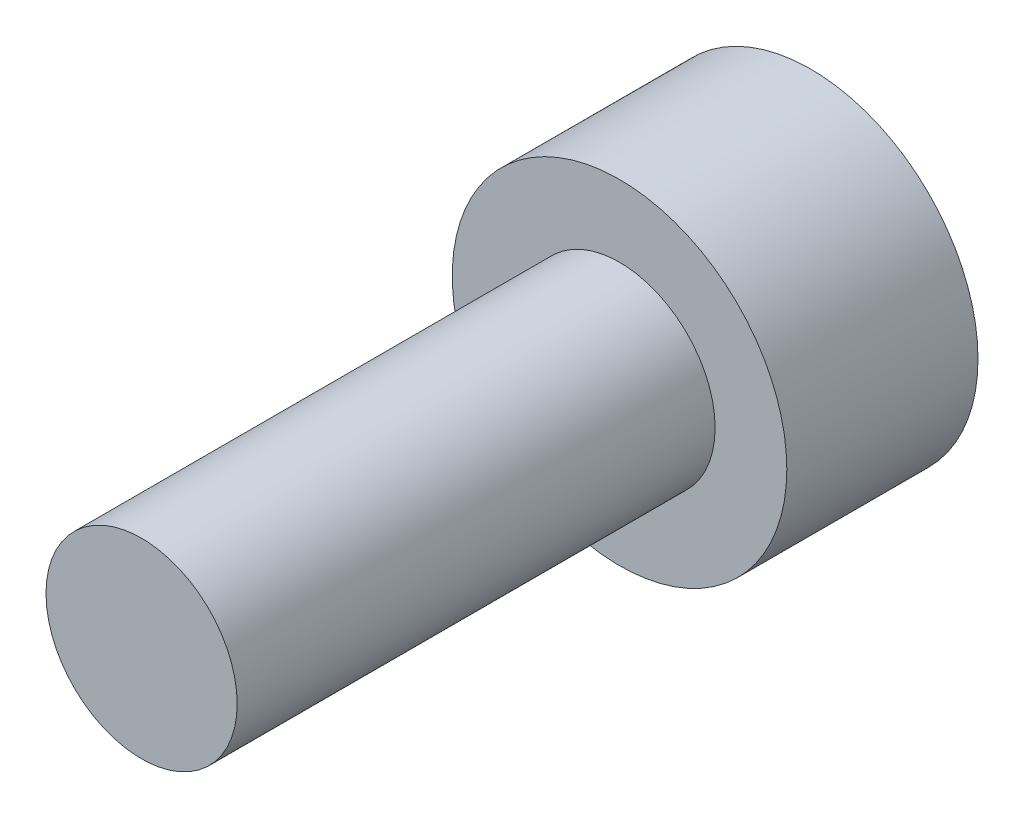
ISO-10303-21;
HEADER;
FILE_DESCRIPTION(('STEP AP214'),'2;1');
FILE_NAME('part.step','',(''),(''),'','','');
FILE_SCHEMA(('AUTOMOTIVE_DESIGN { 1 0 10303 214 1 1 1 1 }'));
ENDSEC;
DATA;
#1=APPLICATION_CONTEXT('core data for automotive mechanical design processes');
#2=APPLICATION_PROTOCOL_DEFINITION('international standard','automotive_design',2000,#1);
#3=PRODUCT_CONTEXT('',#1,'mechanical');
#4=PRODUCT('Part','Part','',(#3));
#5=PRODUCT_RELATED_PRODUCT_CATEGORY('part','',(#4));
#6=PRODUCT_DEFINITION_FORMATION('','',#4);
#7=PRODUCT_DEFINITION_CONTEXT('part definition',#1,'design');
#8=PRODUCT_DEFINITION('design','',#6,#7);
#9=PRODUCT_DEFINITION_SHAPE('','',#8);
#10=(LENGTH_UNIT() NAMED_UNIT(*) SI_UNIT(.MILLI.,.METRE.));
#11=(NAMED_UNIT(*) PLANE_ANGLE_UNIT() SI_UNIT($,.RADIAN.));
#12=(NAMED_UNIT(*) SI_UNIT($,.STERADIAN.) SOLID_ANGLE_UNIT());
#13=UNCERTAINTY_MEASURE_WITH_UNIT(LENGTH_MEASURE(1.E-05),#10,'distance_accuracy_value','');
#14=(GEOMETRIC_REPRESENTATION_CONTEXT(3) GLOBAL_UNCERTAINTY_ASSIGNED_CONTEXT((#13)) GLOBAL_UNIT_ASSIGNED_CONTEXT((#10,
#11,#12)) REPRESENTATION_CONTEXT('',''));
#15=CARTESIAN_POINT('',(0.,0.,0.));
#16=DIRECTION('',(0.,0.,1.));
#17=DIRECTION('',(1.,0.,0.));
#18=AXIS2_PLACEMENT_3D('',#15,#16,#17);
#19=CARTESIAN_POINT('',(0.,0.,-4.));
#20=DIRECTION('',(0.,0.,1.));
#21=DIRECTION('',(1.,0.,0.));
#22=AXIS2_PLACEMENT_3D('',#19,#20,#21);
#23=PLANE('',#22);
#24=CARTESIAN_POINT('',(0.,0.,-4.));
#25=DIRECTION('',(0.,0.,1.));
#26=DIRECTION('',(1.,0.,0.));
#27=AXIS2_PLACEMENT_3D('',#24,#25,#26);
#28=CIRCLE('',#27,3.5);
#29=CARTESIAN_POINT('',(3.5,0.,-4.));
#30=VERTEX_POINT('',#29);
#31=EDGE_CURVE('E47',#30,#30,#28,.T.);
#32=ORIENTED_EDGE('',*,*,#31,.F.);
#33=EDGE_LOOP('',(#32));
#34=FACE_BOUND('',#33,.T.);
#35=DIRECTION('',(0.5,0.866025403784439,0.));
#36=VECTOR('',#35,1.);
#37=CARTESIAN_POINT('',(0.866025403784439,-1.5,-4.));
#38=LINE('',#37,#36);
#39=CARTESIAN_POINT('',(0.866025403784439,-1.5,-4.));
#40=VERTEX_POINT('',#39);
#41=CARTESIAN_POINT('',(1.73205080756888,0.,-4.));
#42=VERTEX_POINT('',#41);
#43=EDGE_CURVE('E62',#40,#42,#38,.T.);
#44=ORIENTED_EDGE('',*,*,#43,.T.);
#45=DIRECTION('',(-0.5,0.866025403784439,0.));
#46=VECTOR('',#45,1.);
#47=CARTESIAN_POINT('',(1.73205080756888,0.,-4.));
#48=LINE('',#47,#46);
#49=CARTESIAN_POINT('',(0.866025403784439,1.5,-4.));
#50=VERTEX_POINT('',#49);
#51=EDGE_CURVE('E138',#42,#50,#48,.T.);
#52=ORIENTED_EDGE('',*,*,#51,.T.);
#53=DIRECTION('',(-1.,0.,0.));
#54=VECTOR('',#53,1.);
#55=CARTESIAN_POINT('',(0.866025403784439,1.5,-4.));
#56=LINE('',#55,#54);
#57=CARTESIAN_POINT('',(-0.866025403784438,1.5,-4.));
#58=VERTEX_POINT('',#57);
#59=EDGE_CURVE('E141',#50,#58,#56,.T.);
#60=ORIENTED_EDGE('',*,*,#59,.T.);
#61=DIRECTION('',(-0.5,-0.866025403784439,0.));
#62=VECTOR('',#61,1.);
#63=CARTESIAN_POINT('',(-0.866025403784438,1.5,-4.));
#64=LINE('',#63,#62);
#65=CARTESIAN_POINT('',(-1.73205080756888,0.,-4.));
#66=VERTEX_POINT('',#65);
#67=EDGE_CURVE('E150',#58,#66,#64,.T.);
#68=ORIENTED_EDGE('',*,*,#67,.T.);
#69=DIRECTION('',(0.5,-0.866025403784439,0.));
#70=VECTOR('',#69,1.);
#71=CARTESIAN_POINT('',(-1.73205080756888,0.,-4.));
#72=LINE('',#71,#70);
#73=CARTESIAN_POINT('',(-0.866025403784439,-1.5,-4.));
#74=VERTEX_POINT('',#73);
#75=EDGE_CURVE('E125',#66,#74,#72,.T.);
#76=ORIENTED_EDGE('',*,*,#75,.T.);
#77=DIRECTION('',(1.,0.,0.));
#78=VECTOR('',#77,1.);
#79=CARTESIAN_POINT('',(-0.866025403784439,-1.5,-4.));
#80=LINE('',#79,#78);
#81=EDGE_CURVE('E155',#74,#40,#80,.T.);
#82=ORIENTED_EDGE('',*,*,#81,.T.);
#83=EDGE_LOOP('',(#44,#52,#60,#68,#76,#82));
#84=FACE_BOUND('',#83,.T.);
#85=ADVANCED_FACE('F44',(#34,#84),#23,.F.);
#86=CARTESIAN_POINT('',(0.,0.,0.));
#87=DIRECTION('',(0.,0.,-1.));
#88=DIRECTION('',(-1.,0.,0.));
#89=AXIS2_PLACEMENT_3D('',#86,#87,#88);
#90=CYLINDRICAL_SURFACE('',#89,3.5);
#91=CARTESIAN_POINT('',(0.,0.,0.));
#92=DIRECTION('',(0.,0.,1.));
#93=DIRECTION('',(1.,0.,0.));
#94=AXIS2_PLACEMENT_3D('',#91,#92,#93);
#95=CIRCLE('',#94,3.5);
#96=CARTESIAN_POINT('',(3.5,0.,0.));
#97=VERTEX_POINT('',#96);
#98=EDGE_CURVE('E54',#97,#97,#95,.T.);
#99=ORIENTED_EDGE('',*,*,#98,.F.);
#100=EDGE_LOOP('',(#99));
#101=FACE_BOUND('',#100,.T.);
#102=ORIENTED_EDGE('',*,*,#31,.T.);
#103=EDGE_LOOP('',(#102));
#104=FACE_BOUND('',#103,.T.);
#105=ADVANCED_FACE('F50',(#101,#104),#90,.T.);
#106=CARTESIAN_POINT('',(0.,0.,0.));
#107=DIRECTION('',(0.,0.,1.));
#108=DIRECTION('',(1.,0.,0.));
#109=AXIS2_PLACEMENT_3D('',#106,#107,#108);
#110=PLANE('',#109);
#111=CARTESIAN_POINT('',(0.,0.,0.));
#112=DIRECTION('',(0.,0.,1.));
#113=DIRECTION('',(1.,0.,0.));
#114=AXIS2_PLACEMENT_3D('',#111,#112,#113);
#115=CIRCLE('',#114,2.);
#116=CARTESIAN_POINT('',(2.,0.,0.));
#117=VERTEX_POINT('',#116);
#118=EDGE_CURVE('E11',#117,#117,#115,.T.);
#119=ORIENTED_EDGE('',*,*,#118,.F.);
#120=EDGE_LOOP('',(#119));
#121=FACE_BOUND('',#120,.T.);
#122=ORIENTED_EDGE('',*,*,#98,.T.);
#123=EDGE_LOOP('',(#122));
#124=FACE_BOUND('',#123,.T.);
#125=ADVANCED_FACE('F212',(#121,#124),#110,.T.);
#126=CARTESIAN_POINT('',(0.,0.,10.));
#127=DIRECTION('',(0.,0.,-1.));
#128=DIRECTION('',(-1.,0.,0.));
#129=AXIS2_PLACEMENT_3D('',#126,#127,#128);
#130=CYLINDRICAL_SURFACE('',#129,2.);
#131=CARTESIAN_POINT('',(0.,0.,10.));
#132=DIRECTION('',(0.,0.,1.));
#133=DIRECTION('',(1.,0.,0.));
#134=AXIS2_PLACEMENT_3D('',#131,#132,#133);
#135=CIRCLE('',#134,2.);
#136=CARTESIAN_POINT('',(2.,0.,10.));
#137=VERTEX_POINT('',#136);
#138=EDGE_CURVE('E166',#137,#137,#135,.T.);
#139=ORIENTED_EDGE('',*,*,#138,.F.);
#140=EDGE_LOOP('',(#139));
#141=FACE_BOUND('',#140,.T.);
#142=ORIENTED_EDGE('',*,*,#118,.T.);
#143=EDGE_LOOP('',(#142));
#144=FACE_BOUND('',#143,.T.);
#145=ADVANCED_FACE('F209',(#141,#144),#130,.T.);
#146=CARTESIAN_POINT('',(0.,0.,10.));
#147=DIRECTION('',(0.,0.,1.));
#148=DIRECTION('',(1.,0.,0.));
#149=AXIS2_PLACEMENT_3D('',#146,#147,#148);
#150=PLANE('',#149);
#151=ORIENTED_EDGE('',*,*,#138,.T.);
#152=EDGE_LOOP('',(#151));
#153=FACE_BOUND('',#152,.T.);
#154=ADVANCED_FACE('F204',(#153),#150,.T.);
#155=CARTESIAN_POINT('',(0.866025403784439,-1.5,-2.));
#156=DIRECTION('',(-0.866025403784439,0.5,0.));
#157=DIRECTION('',(-0.5,-0.866025403784439,0.));
#158=AXIS2_PLACEMENT_3D('',#155,#156,#157);
#159=PLANE('',#158);
#160=ORIENTED_EDGE('',*,*,#43,.F.);
#161=DIRECTION('',(0.,0.,-1.));
#162=VECTOR('',#161,1.);
#163=CARTESIAN_POINT('',(0.866025403784439,-1.5,-2.));
#164=LINE('',#163,#162);
#165=CARTESIAN_POINT('',(0.866025403784439,-1.5,-2.));
#166=VERTEX_POINT('',#165);
#167=EDGE_CURVE('E132',#166,#40,#164,.T.);
#168=ORIENTED_EDGE('',*,*,#167,.F.);
#169=DIRECTION('',(0.5,0.866025403784439,0.));
#170=VECTOR('',#169,1.);
#171=CARTESIAN_POINT('',(0.866025403784439,-1.5,-2.));
#172=LINE('',#171,#170);
#173=CARTESIAN_POINT('',(1.73205080756888,0.,-2.));
#174=VERTEX_POINT('',#173);
#175=EDGE_CURVE('E156',#166,#174,#172,.T.);
#176=ORIENTED_EDGE('',*,*,#175,.T.);
#177=DIRECTION('',(0.,0.,-1.));
#178=VECTOR('',#177,1.);
#179=CARTESIAN_POINT('',(1.73205080756888,0.,-2.));
#180=LINE('',#179,#178);
#181=EDGE_CURVE('E167',#174,#42,#180,.T.);
#182=ORIENTED_EDGE('',*,*,#181,.T.);
#183=EDGE_LOOP('',(#160,#168,#176,#182));
#184=FACE_BOUND('',#183,.T.);
#185=ADVANCED_FACE('F184',(#184),#159,.T.);
#186=CARTESIAN_POINT('',(1.73205080756888,0.,-2.));
#187=DIRECTION('',(-0.866025403784439,-0.5,0.));
#188=DIRECTION('',(0.5,-0.866025403784439,0.));
#189=AXIS2_PLACEMENT_3D('',#186,#187,#188);
#190=PLANE('',#189);
#191=ORIENTED_EDGE('',*,*,#51,.F.);
#192=ORIENTED_EDGE('',*,*,#181,.F.);
#193=DIRECTION('',(-0.5,0.866025403784439,0.));
#194=VECTOR('',#193,1.);
#195=CARTESIAN_POINT('',(1.73205080756888,0.,-2.));
#196=LINE('',#195,#194);
#197=CARTESIAN_POINT('',(0.866025403784439,1.5,-2.));
#198=VERTEX_POINT('',#197);
#199=EDGE_CURVE('E105',#174,#198,#196,.T.);
#200=ORIENTED_EDGE('',*,*,#199,.T.);
#201=DIRECTION('',(0.,0.,-1.));
#202=VECTOR('',#201,1.);
#203=CARTESIAN_POINT('',(0.866025403784439,1.5,-2.));
#204=LINE('',#203,#202);
#205=EDGE_CURVE('E162',#198,#50,#204,.T.);
#206=ORIENTED_EDGE('',*,*,#205,.T.);
#207=EDGE_LOOP('',(#191,#192,#200,#206));
#208=FACE_BOUND('',#207,.T.);
#209=ADVANCED_FACE('F198',(#208),#190,.T.);
#210=CARTESIAN_POINT('',(0.866025403784439,1.5,-2.));
#211=DIRECTION('',(0.,-1.,0.));
#212=DIRECTION('',(1.,0.,0.));
#213=AXIS2_PLACEMENT_3D('',#210,#211,#212);
#214=PLANE('',#213);
#215=ORIENTED_EDGE('',*,*,#59,.F.);
#216=ORIENTED_EDGE('',*,*,#205,.F.);
#217=DIRECTION('',(-1.,0.,0.));
#218=VECTOR('',#217,1.);
#219=CARTESIAN_POINT('',(0.866025403784439,1.5,-2.));
#220=LINE('',#219,#218);
#221=CARTESIAN_POINT('',(-0.866025403784438,1.5,-2.));
#222=VERTEX_POINT('',#221);
#223=EDGE_CURVE('E121',#198,#222,#220,.T.);
#224=ORIENTED_EDGE('',*,*,#223,.T.);
#225=DIRECTION('',(0.,0.,-1.));
#226=VECTOR('',#225,1.);
#227=CARTESIAN_POINT('',(-0.866025403784438,1.5,-2.));
#228=LINE('',#227,#226);
#229=EDGE_CURVE('E119',#222,#58,#228,.T.);
#230=ORIENTED_EDGE('',*,*,#229,.T.);
#231=EDGE_LOOP('',(#215,#216,#224,#230));
#232=FACE_BOUND('',#231,.T.);
#233=ADVANCED_FACE('F193',(#232),#214,.T.);
#234=CARTESIAN_POINT('',(-0.866025403784438,1.5,-2.));
#235=DIRECTION('',(0.866025403784439,-0.5,0.));
#236=DIRECTION('',(0.5,0.866025403784439,0.));
#237=AXIS2_PLACEMENT_3D('',#234,#235,#236);
#238=PLANE('',#237);
#239=ORIENTED_EDGE('',*,*,#67,.F.);
#240=ORIENTED_EDGE('',*,*,#229,.F.);
#241=DIRECTION('',(-0.5,-0.866025403784439,0.));
#242=VECTOR('',#241,1.);
#243=CARTESIAN_POINT('',(-0.866025403784438,1.5,-2.));
#244=LINE('',#243,#242);
#245=CARTESIAN_POINT('',(-1.73205080756888,0.,-2.));
#246=VERTEX_POINT('',#245);
#247=EDGE_CURVE('E115',#222,#246,#244,.T.);
#248=ORIENTED_EDGE('',*,*,#247,.T.);
#249=DIRECTION('',(0.,0.,-1.));
#250=VECTOR('',#249,1.);
#251=CARTESIAN_POINT('',(-1.73205080756888,0.,-2.));
#252=LINE('',#251,#250);
#253=EDGE_CURVE('E118',#246,#66,#252,.T.);
#254=ORIENTED_EDGE('',*,*,#253,.T.);
#255=EDGE_LOOP('',(#239,#240,#248,#254));
#256=FACE_BOUND('',#255,.T.);
#257=ADVANCED_FACE('F113',(#256),#238,.T.);
#258=CARTESIAN_POINT('',(-1.73205080756888,0.,-2.));
#259=DIRECTION('',(0.866025403784439,0.5,0.));
#260=DIRECTION('',(-0.5,0.866025403784439,0.));
#261=AXIS2_PLACEMENT_3D('',#258,#259,#260);
#262=PLANE('',#261);
#263=ORIENTED_EDGE('',*,*,#75,.F.);
#264=ORIENTED_EDGE('',*,*,#253,.F.);
#265=DIRECTION('',(0.5,-0.866025403784439,0.));
#266=VECTOR('',#265,1.);
#267=CARTESIAN_POINT('',(-1.73205080756888,0.,-2.));
#268=LINE('',#267,#266);
#269=CARTESIAN_POINT('',(-0.866025403784439,-1.5,-2.));
#270=VERTEX_POINT('',#269);
#271=EDGE_CURVE('E116',#246,#270,#268,.T.);
#272=ORIENTED_EDGE('',*,*,#271,.T.);
#273=DIRECTION('',(0.,0.,-1.));
#274=VECTOR('',#273,1.);
#275=CARTESIAN_POINT('',(-0.866025403784439,-1.5,-2.));
#276=LINE('',#275,#274);
#277=EDGE_CURVE('E91',#270,#74,#276,.T.);
#278=ORIENTED_EDGE('',*,*,#277,.T.);
#279=EDGE_LOOP('',(#263,#264,#272,#278));
#280=FACE_BOUND('',#279,.T.);
#281=ADVANCED_FACE('F124',(#280),#262,.T.);
#282=CARTESIAN_POINT('',(-0.866025403784439,-1.5,-2.));
#283=DIRECTION('',(0.,1.,0.));
#284=DIRECTION('',(-1.,0.,0.));
#285=AXIS2_PLACEMENT_3D('',#282,#283,#284);
#286=PLANE('',#285);
#287=ORIENTED_EDGE('',*,*,#81,.F.);
#288=ORIENTED_EDGE('',*,*,#277,.F.);
#289=DIRECTION('',(1.,0.,0.));
#290=VECTOR('',#289,1.);
#291=CARTESIAN_POINT('',(-0.866025403784439,-1.5,-2.));
#292=LINE('',#291,#290);
#293=EDGE_CURVE('E72',#270,#166,#292,.T.);
#294=ORIENTED_EDGE('',*,*,#293,.T.);
#295=ORIENTED_EDGE('',*,*,#167,.T.);
#296=EDGE_LOOP('',(#287,#288,#294,#295));
#297=FACE_BOUND('',#296,.T.);
#298=ADVANCED_FACE('F181',(#297),#286,.T.);
#299=CARTESIAN_POINT('',(0.,0.,-2.));
#300=DIRECTION('',(0.,0.,1.));
#301=DIRECTION('',(1.,0.,0.));
#302=AXIS2_PLACEMENT_3D('',#299,#300,#301);
#303=PLANE('',#302);
#304=ORIENTED_EDGE('',*,*,#175,.F.);
#305=ORIENTED_EDGE('',*,*,#293,.F.);
#306=ORIENTED_EDGE('',*,*,#271,.F.);
#307=ORIENTED_EDGE('',*,*,#247,.F.);
#308=ORIENTED_EDGE('',*,*,#223,.F.);
#309=ORIENTED_EDGE('',*,*,#199,.F.);
#310=EDGE_LOOP('',(#304,#305,#306,#307,#308,#309));
#311=FACE_BOUND('',#310,.T.);
#312=ADVANCED_FACE('F129',(#311),#303,.F.);
#313=CLOSED_SHELL('',(#85,#105,#125,#145,#154,#185,#209,#233,#257,#281,#298,#312));
#314=MANIFOLD_SOLID_BREP('B2',#313);
#315=ADVANCED_BREP_SHAPE_REPRESENTATION('',(#18,#314),#14);
#316=SHAPE_DEFINITION_REPRESENTATION(#9,#315);
ENDSEC;
END-ISO-10303-21;
